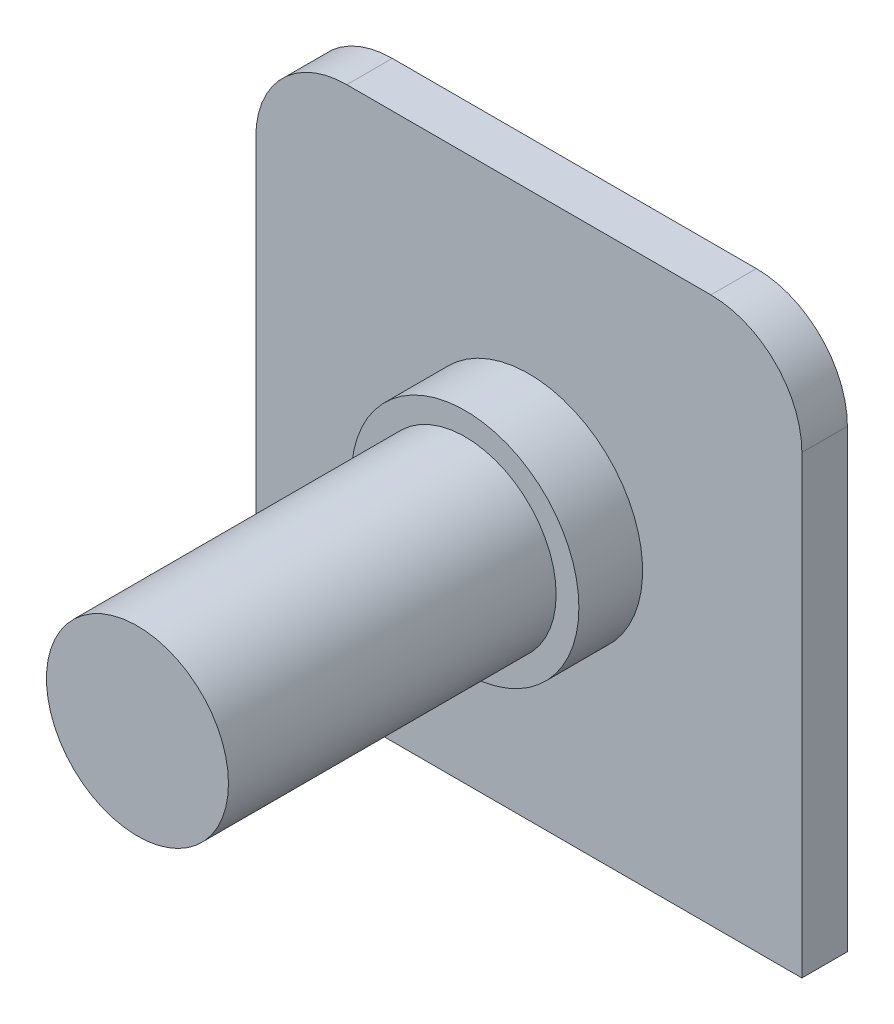
ISO-10303-21;
HEADER;
FILE_DESCRIPTION(('STEP AP214'),'2;1');
FILE_NAME('part.step','',(''),(''),'','','');
FILE_SCHEMA(('AUTOMOTIVE_DESIGN { 1 0 10303 214 1 1 1 1 }'));
ENDSEC;
DATA;
#1=APPLICATION_CONTEXT('core data for automotive mechanical design processes');
#2=APPLICATION_PROTOCOL_DEFINITION('international standard','automotive_design',2000,#1);
#3=PRODUCT_CONTEXT('',#1,'mechanical');
#4=PRODUCT('Part','Part','',(#3));
#5=PRODUCT_RELATED_PRODUCT_CATEGORY('part','',(#4));
#6=PRODUCT_DEFINITION_FORMATION('','',#4);
#7=PRODUCT_DEFINITION_CONTEXT('part definition',#1,'design');
#8=PRODUCT_DEFINITION('design','',#6,#7);
#9=PRODUCT_DEFINITION_SHAPE('','',#8);
#10=(LENGTH_UNIT() NAMED_UNIT(*) SI_UNIT(.MILLI.,.METRE.));
#11=(NAMED_UNIT(*) PLANE_ANGLE_UNIT() SI_UNIT($,.RADIAN.));
#12=(NAMED_UNIT(*) SI_UNIT($,.STERADIAN.) SOLID_ANGLE_UNIT());
#13=UNCERTAINTY_MEASURE_WITH_UNIT(LENGTH_MEASURE(1.E-05),#10,'distance_accuracy_value','');
#14=(GEOMETRIC_REPRESENTATION_CONTEXT(3) GLOBAL_UNCERTAINTY_ASSIGNED_CONTEXT((#13)) GLOBAL_UNIT_ASSIGNED_CONTEXT((#10,
#11,#12)) REPRESENTATION_CONTEXT('',''));
#15=CARTESIAN_POINT('',(0.,0.,0.));
#16=DIRECTION('',(0.,0.,1.));
#17=DIRECTION('',(1.,0.,0.));
#18=AXIS2_PLACEMENT_3D('',#15,#16,#17);
#19=CARTESIAN_POINT('',(762.,-762.,127.));
#20=DIRECTION('',(-1.,0.,0.));
#21=DIRECTION('',(0.,0.,1.));
#22=AXIS2_PLACEMENT_3D('',#19,#20,#21);
#23=PLANE('',#22);
#24=DIRECTION('',(0.,1.,0.));
#25=VECTOR('',#24,1.);
#26=CARTESIAN_POINT('',(762.,-762.,0.));
#27=LINE('',#26,#25);
#28=CARTESIAN_POINT('',(762.,-762.,0.));
#29=VERTEX_POINT('',#28);
#30=CARTESIAN_POINT('',(762.,508.,0.));
#31=VERTEX_POINT('',#30);
#32=EDGE_CURVE('E129',#29,#31,#27,.T.);
#33=ORIENTED_EDGE('',*,*,#32,.T.);
#34=DIRECTION('',(0.,0.,-1.));
#35=VECTOR('',#34,1.);
#36=CARTESIAN_POINT('',(762.,508.,127.));
#37=LINE('',#36,#35);
#38=CARTESIAN_POINT('',(762.,508.,127.));
#39=VERTEX_POINT('',#38);
#40=EDGE_CURVE('E68',#31,#39,#37,.F.);
#41=ORIENTED_EDGE('',*,*,#40,.T.);
#42=DIRECTION('',(0.,1.,0.));
#43=VECTOR('',#42,1.);
#44=CARTESIAN_POINT('',(762.,-762.,127.));
#45=LINE('',#44,#43);
#46=CARTESIAN_POINT('',(762.,-762.,127.));
#47=VERTEX_POINT('',#46);
#48=EDGE_CURVE('E143',#47,#39,#45,.T.);
#49=ORIENTED_EDGE('',*,*,#48,.F.);
#50=DIRECTION('',(0.,0.,-1.));
#51=VECTOR('',#50,1.);
#52=CARTESIAN_POINT('',(762.,-762.,127.));
#53=LINE('',#52,#51);
#54=EDGE_CURVE('E118',#47,#29,#53,.T.);
#55=ORIENTED_EDGE('',*,*,#54,.T.);
#56=EDGE_LOOP('',(#33,#41,#49,#55));
#57=FACE_BOUND('',#56,.T.);
#58=ADVANCED_FACE('F44',(#57),#23,.F.);
#59=CARTESIAN_POINT('',(-762.,762.,127.));
#60=DIRECTION('',(0.,-1.,0.));
#61=DIRECTION('',(0.,0.,-1.));
#62=AXIS2_PLACEMENT_3D('',#59,#60,#61);
#63=PLANE('',#62);
#64=DIRECTION('',(-1.,0.,0.));
#65=VECTOR('',#64,1.);
#66=CARTESIAN_POINT('',(-762.,762.,127.));
#67=LINE('',#66,#65);
#68=CARTESIAN_POINT('',(508.,762.,127.));
#69=VERTEX_POINT('',#68);
#70=CARTESIAN_POINT('',(-508.,762.,127.));
#71=VERTEX_POINT('',#70);
#72=EDGE_CURVE('E107',#69,#71,#67,.T.);
#73=ORIENTED_EDGE('',*,*,#72,.F.);
#74=DIRECTION('',(0.,0.,-1.));
#75=VECTOR('',#74,1.);
#76=CARTESIAN_POINT('',(508.,762.,127.));
#77=LINE('',#76,#75);
#78=CARTESIAN_POINT('',(508.,762.,0.));
#79=VERTEX_POINT('',#78);
#80=EDGE_CURVE('E152',#69,#79,#77,.T.);
#81=ORIENTED_EDGE('',*,*,#80,.T.);
#82=DIRECTION('',(-1.,0.,0.));
#83=VECTOR('',#82,1.);
#84=CARTESIAN_POINT('',(-762.,762.,0.));
#85=LINE('',#84,#83);
#86=CARTESIAN_POINT('',(-508.,762.,0.));
#87=VERTEX_POINT('',#86);
#88=EDGE_CURVE('E131',#79,#87,#85,.T.);
#89=ORIENTED_EDGE('',*,*,#88,.T.);
#90=DIRECTION('',(0.,0.,-1.));
#91=VECTOR('',#90,1.);
#92=CARTESIAN_POINT('',(-508.,762.,127.));
#93=LINE('',#92,#91);
#94=EDGE_CURVE('E151',#87,#71,#93,.F.);
#95=ORIENTED_EDGE('',*,*,#94,.T.);
#96=EDGE_LOOP('',(#73,#81,#89,#95));
#97=FACE_BOUND('',#96,.T.);
#98=ADVANCED_FACE('F175',(#97),#63,.F.);
#99=CARTESIAN_POINT('',(-762.,-762.,127.));
#100=DIRECTION('',(1.,0.,0.));
#101=DIRECTION('',(0.,0.,-1.));
#102=AXIS2_PLACEMENT_3D('',#99,#100,#101);
#103=PLANE('',#102);
#104=DIRECTION('',(0.,-1.,0.));
#105=VECTOR('',#104,1.);
#106=CARTESIAN_POINT('',(-762.,-762.,127.));
#107=LINE('',#106,#105);
#108=CARTESIAN_POINT('',(-762.,508.,127.));
#109=VERTEX_POINT('',#108);
#110=CARTESIAN_POINT('',(-762.,-762.,127.));
#111=VERTEX_POINT('',#110);
#112=EDGE_CURVE('E97',#109,#111,#107,.T.);
#113=ORIENTED_EDGE('',*,*,#112,.F.);
#114=DIRECTION('',(0.,0.,-1.));
#115=VECTOR('',#114,1.);
#116=CARTESIAN_POINT('',(-762.,508.,127.));
#117=LINE('',#116,#115);
#118=CARTESIAN_POINT('',(-762.,508.,0.));
#119=VERTEX_POINT('',#118);
#120=EDGE_CURVE('E11',#109,#119,#117,.T.);
#121=ORIENTED_EDGE('',*,*,#120,.T.);
#122=DIRECTION('',(0.,-1.,0.));
#123=VECTOR('',#122,1.);
#124=CARTESIAN_POINT('',(-762.,-762.,0.));
#125=LINE('',#124,#123);
#126=CARTESIAN_POINT('',(-762.,-762.,0.));
#127=VERTEX_POINT('',#126);
#128=EDGE_CURVE('E111',#119,#127,#125,.T.);
#129=ORIENTED_EDGE('',*,*,#128,.T.);
#130=DIRECTION('',(0.,0.,-1.));
#131=VECTOR('',#130,1.);
#132=CARTESIAN_POINT('',(-762.,-762.,127.));
#133=LINE('',#132,#131);
#134=EDGE_CURVE('E112',#111,#127,#133,.T.);
#135=ORIENTED_EDGE('',*,*,#134,.F.);
#136=EDGE_LOOP('',(#113,#121,#129,#135));
#137=FACE_BOUND('',#136,.T.);
#138=ADVANCED_FACE('F115',(#137),#103,.F.);
#139=CARTESIAN_POINT('',(-762.,-762.,127.));
#140=DIRECTION('',(0.,1.,0.));
#141=DIRECTION('',(0.,0.,1.));
#142=AXIS2_PLACEMENT_3D('',#139,#140,#141);
#143=PLANE('',#142);
#144=DIRECTION('',(1.,0.,0.));
#145=VECTOR('',#144,1.);
#146=CARTESIAN_POINT('',(-762.,-762.,0.));
#147=LINE('',#146,#145);
#148=EDGE_CURVE('E138',#127,#29,#147,.T.);
#149=ORIENTED_EDGE('',*,*,#148,.T.);
#150=ORIENTED_EDGE('',*,*,#54,.F.);
#151=DIRECTION('',(1.,0.,0.));
#152=VECTOR('',#151,1.);
#153=CARTESIAN_POINT('',(-762.,-762.,127.));
#154=LINE('',#153,#152);
#155=EDGE_CURVE('E103',#111,#47,#154,.T.);
#156=ORIENTED_EDGE('',*,*,#155,.F.);
#157=ORIENTED_EDGE('',*,*,#134,.T.);
#158=EDGE_LOOP('',(#149,#150,#156,#157));
#159=FACE_BOUND('',#158,.T.);
#160=ADVANCED_FACE('F121',(#159),#143,.F.);
#161=CARTESIAN_POINT('',(0.,0.,127.));
#162=DIRECTION('',(0.,0.,-1.));
#163=DIRECTION('',(-1.,0.,0.));
#164=AXIS2_PLACEMENT_3D('',#161,#162,#163);
#165=PLANE('',#164);
#166=CARTESIAN_POINT('',(0.,0.,127.));
#167=DIRECTION('',(0.,0.,-1.));
#168=DIRECTION('',(-1.,0.,0.));
#169=AXIS2_PLACEMENT_3D('',#166,#167,#168);
#170=CIRCLE('',#169,317.5);
#171=CARTESIAN_POINT('',(-317.5,0.,127.));
#172=VERTEX_POINT('',#171);
#173=EDGE_CURVE('E120',#172,#172,#170,.F.);
#174=ORIENTED_EDGE('',*,*,#173,.F.);
#175=EDGE_LOOP('',(#174));
#176=FACE_BOUND('',#175,.T.);
#177=ORIENTED_EDGE('',*,*,#48,.T.);
#178=CARTESIAN_POINT('',(508.,508.,127.));
#179=DIRECTION('',(0.,0.,-1.));
#180=DIRECTION('',(-1.,0.,0.));
#181=AXIS2_PLACEMENT_3D('',#178,#179,#180);
#182=CIRCLE('',#181,254.);
#183=EDGE_CURVE('E53',#39,#69,#182,.F.);
#184=ORIENTED_EDGE('',*,*,#183,.T.);
#185=ORIENTED_EDGE('',*,*,#72,.T.);
#186=CARTESIAN_POINT('',(-508.,508.,127.));
#187=DIRECTION('',(0.,0.,-1.));
#188=DIRECTION('',(-1.,0.,0.));
#189=AXIS2_PLACEMENT_3D('',#186,#187,#188);
#190=CIRCLE('',#189,254.);
#191=EDGE_CURVE('E64',#71,#109,#190,.F.);
#192=ORIENTED_EDGE('',*,*,#191,.T.);
#193=ORIENTED_EDGE('',*,*,#112,.T.);
#194=ORIENTED_EDGE('',*,*,#155,.T.);
#195=EDGE_LOOP('',(#177,#184,#185,#192,#193,#194));
#196=FACE_BOUND('',#195,.T.);
#197=ADVANCED_FACE('F101',(#176,#196),#165,.F.);
#198=CARTESIAN_POINT('',(0.,0.,0.));
#199=DIRECTION('',(0.,0.,-1.));
#200=DIRECTION('',(-1.,0.,0.));
#201=AXIS2_PLACEMENT_3D('',#198,#199,#200);
#202=PLANE('',#201);
#203=ORIENTED_EDGE('',*,*,#88,.F.);
#204=CARTESIAN_POINT('',(508.,508.,0.));
#205=DIRECTION('',(0.,0.,-1.));
#206=DIRECTION('',(-1.,0.,0.));
#207=AXIS2_PLACEMENT_3D('',#204,#205,#206);
#208=CIRCLE('',#207,254.);
#209=EDGE_CURVE('E161',#79,#31,#208,.T.);
#210=ORIENTED_EDGE('',*,*,#209,.T.);
#211=ORIENTED_EDGE('',*,*,#32,.F.);
#212=ORIENTED_EDGE('',*,*,#148,.F.);
#213=ORIENTED_EDGE('',*,*,#128,.F.);
#214=CARTESIAN_POINT('',(-508.,508.,0.));
#215=DIRECTION('',(0.,0.,-1.));
#216=DIRECTION('',(-1.,0.,0.));
#217=AXIS2_PLACEMENT_3D('',#214,#215,#216);
#218=CIRCLE('',#217,254.);
#219=EDGE_CURVE('E158',#119,#87,#218,.T.);
#220=ORIENTED_EDGE('',*,*,#219,.T.);
#221=EDGE_LOOP('',(#203,#210,#211,#212,#213,#220));
#222=FACE_BOUND('',#221,.T.);
#223=ADVANCED_FACE('F180',(#222),#202,.T.);
#224=CARTESIAN_POINT('',(0.,0.,304.8));
#225=DIRECTION('',(0.,0.,-1.));
#226=DIRECTION('',(-1.,0.,0.));
#227=AXIS2_PLACEMENT_3D('',#224,#225,#226);
#228=CYLINDRICAL_SURFACE('',#227,317.5);
#229=CARTESIAN_POINT('',(0.,0.,304.8));
#230=DIRECTION('',(0.,0.,1.));
#231=DIRECTION('',(1.,0.,0.));
#232=AXIS2_PLACEMENT_3D('',#229,#230,#231);
#233=CIRCLE('',#232,317.5);
#234=CARTESIAN_POINT('',(317.5,0.,304.8));
#235=VERTEX_POINT('',#234);
#236=EDGE_CURVE('E150',#235,#235,#233,.T.);
#237=ORIENTED_EDGE('',*,*,#236,.F.);
#238=EDGE_LOOP('',(#237));
#239=FACE_BOUND('',#238,.T.);
#240=ORIENTED_EDGE('',*,*,#173,.T.);
#241=EDGE_LOOP('',(#240));
#242=FACE_BOUND('',#241,.T.);
#243=ADVANCED_FACE('F194',(#239,#242),#228,.T.);
#244=CARTESIAN_POINT('',(0.,0.,304.8));
#245=DIRECTION('',(0.,0.,1.));
#246=DIRECTION('',(1.,0.,0.));
#247=AXIS2_PLACEMENT_3D('',#244,#245,#246);
#248=PLANE('',#247);
#249=CARTESIAN_POINT('',(0.,0.,304.8));
#250=DIRECTION('',(0.,0.,1.));
#251=DIRECTION('',(1.,0.,0.));
#252=AXIS2_PLACEMENT_3D('',#249,#250,#251);
#253=CIRCLE('',#252,254.);
#254=CARTESIAN_POINT('',(254.,0.,304.8));
#255=VERTEX_POINT('',#254);
#256=EDGE_CURVE('E141',#255,#255,#253,.T.);
#257=ORIENTED_EDGE('',*,*,#256,.F.);
#258=EDGE_LOOP('',(#257));
#259=FACE_BOUND('',#258,.T.);
#260=ORIENTED_EDGE('',*,*,#236,.T.);
#261=EDGE_LOOP('',(#260));
#262=FACE_BOUND('',#261,.T.);
#263=ADVANCED_FACE('F191',(#259,#262),#248,.T.);
#264=CARTESIAN_POINT('',(0.,0.,1219.2));
#265=DIRECTION('',(0.,0.,1.));
#266=DIRECTION('',(1.,0.,0.));
#267=AXIS2_PLACEMENT_3D('',#264,#265,#266);
#268=PLANE('',#267);
#269=CARTESIAN_POINT('',(0.,0.,1219.2));
#270=DIRECTION('',(0.,0.,1.));
#271=DIRECTION('',(1.,0.,0.));
#272=AXIS2_PLACEMENT_3D('',#269,#270,#271);
#273=CIRCLE('',#272,254.);
#274=CARTESIAN_POINT('',(254.,0.,1219.2));
#275=VERTEX_POINT('',#274);
#276=EDGE_CURVE('E135',#275,#275,#273,.T.);
#277=ORIENTED_EDGE('',*,*,#276,.T.);
#278=EDGE_LOOP('',(#277));
#279=FACE_BOUND('',#278,.T.);
#280=ADVANCED_FACE('F224',(#279),#268,.T.);
#281=CARTESIAN_POINT('',(0.,0.,1219.2));
#282=DIRECTION('',(0.,0.,-1.));
#283=DIRECTION('',(-1.,0.,0.));
#284=AXIS2_PLACEMENT_3D('',#281,#282,#283);
#285=CYLINDRICAL_SURFACE('',#284,254.);
#286=ORIENTED_EDGE('',*,*,#256,.T.);
#287=EDGE_LOOP('',(#286));
#288=FACE_BOUND('',#287,.T.);
#289=ORIENTED_EDGE('',*,*,#276,.F.);
#290=EDGE_LOOP('',(#289));
#291=FACE_BOUND('',#290,.T.);
#292=ADVANCED_FACE('F217',(#288,#291),#285,.T.);
#293=CARTESIAN_POINT('',(508.,508.,127.));
#294=DIRECTION('',(0.,0.,-1.));
#295=DIRECTION('',(-1.,0.,0.));
#296=AXIS2_PLACEMENT_3D('',#293,#294,#295);
#297=CYLINDRICAL_SURFACE('',#296,254.);
#298=ORIENTED_EDGE('',*,*,#183,.F.);
#299=ORIENTED_EDGE('',*,*,#40,.F.);
#300=ORIENTED_EDGE('',*,*,#209,.F.);
#301=ORIENTED_EDGE('',*,*,#80,.F.);
#302=EDGE_LOOP('',(#298,#299,#300,#301));
#303=FACE_BOUND('',#302,.T.);
#304=ADVANCED_FACE('F177',(#303),#297,.T.);
#305=CARTESIAN_POINT('',(-508.,508.,127.));
#306=DIRECTION('',(0.,0.,-1.));
#307=DIRECTION('',(-1.,0.,0.));
#308=AXIS2_PLACEMENT_3D('',#305,#306,#307);
#309=CYLINDRICAL_SURFACE('',#308,254.);
#310=ORIENTED_EDGE('',*,*,#191,.F.);
#311=ORIENTED_EDGE('',*,*,#94,.F.);
#312=ORIENTED_EDGE('',*,*,#219,.F.);
#313=ORIENTED_EDGE('',*,*,#120,.F.);
#314=EDGE_LOOP('',(#310,#311,#312,#313));
#315=FACE_BOUND('',#314,.T.);
#316=ADVANCED_FACE('F50',(#315),#309,.T.);
#317=CLOSED_SHELL('',(#58,#98,#138,#160,#197,#223,#243,#263,#280,#292,#304,#316));
#318=MANIFOLD_SOLID_BREP('B2',#317);
#319=ADVANCED_BREP_SHAPE_REPRESENTATION('',(#18,#318),#14);
#320=SHAPE_DEFINITION_REPRESENTATION(#9,#319);
ENDSEC;
END-ISO-10303-21;
